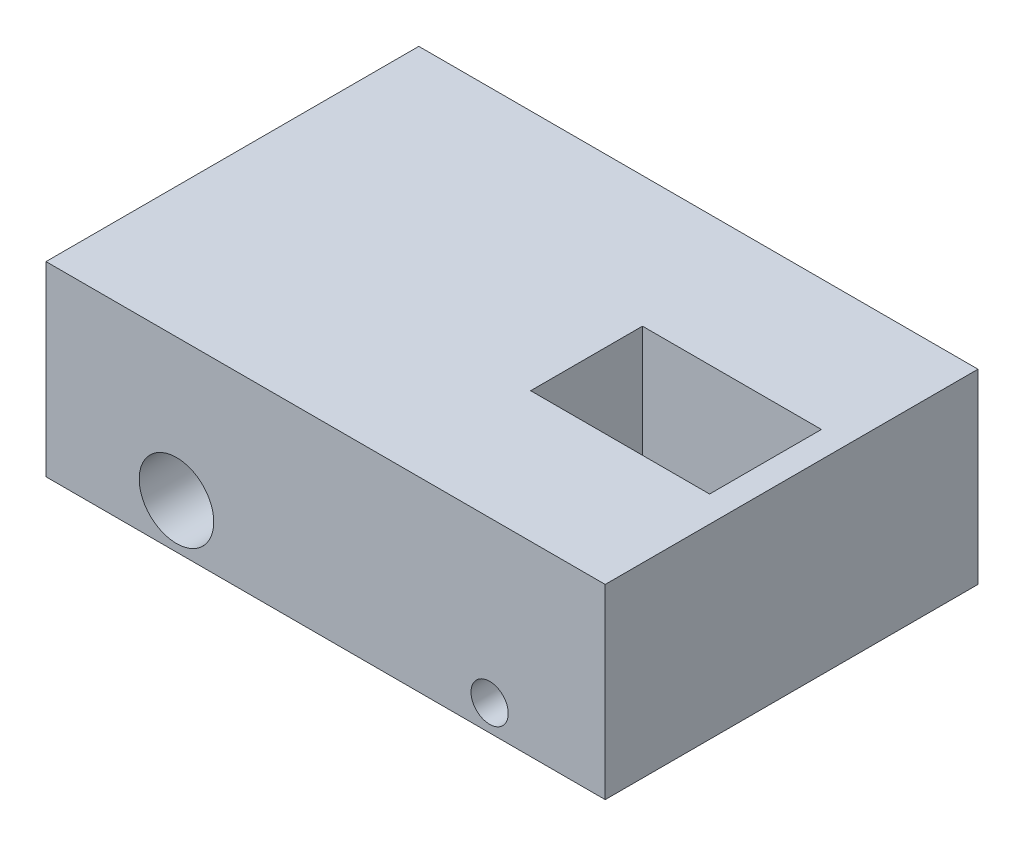
ISO-10303-21;
HEADER;
FILE_DESCRIPTION(('STEP AP214'),'2;1');
FILE_NAME('part.step','',(''),(''),'','','');
FILE_SCHEMA(('AUTOMOTIVE_DESIGN { 1 0 10303 214 1 1 1 1 }'));
ENDSEC;
DATA;
#1=APPLICATION_CONTEXT('core data for automotive mechanical design processes');
#2=APPLICATION_PROTOCOL_DEFINITION('international standard','automotive_design',2000,#1);
#3=PRODUCT_CONTEXT('',#1,'mechanical');
#4=PRODUCT('Part','Part','',(#3));
#5=PRODUCT_RELATED_PRODUCT_CATEGORY('part','',(#4));
#6=PRODUCT_DEFINITION_FORMATION('','',#4);
#7=PRODUCT_DEFINITION_CONTEXT('part definition',#1,'design');
#8=PRODUCT_DEFINITION('design','',#6,#7);
#9=PRODUCT_DEFINITION_SHAPE('','',#8);
#10=(LENGTH_UNIT() NAMED_UNIT(*) SI_UNIT(.MILLI.,.METRE.));
#11=(NAMED_UNIT(*) PLANE_ANGLE_UNIT() SI_UNIT($,.RADIAN.));
#12=(NAMED_UNIT(*) SI_UNIT($,.STERADIAN.) SOLID_ANGLE_UNIT());
#13=UNCERTAINTY_MEASURE_WITH_UNIT(LENGTH_MEASURE(1.E-05),#10,'distance_accuracy_value','');
#14=(GEOMETRIC_REPRESENTATION_CONTEXT(3) GLOBAL_UNCERTAINTY_ASSIGNED_CONTEXT((#13)) GLOBAL_UNIT_ASSIGNED_CONTEXT((#10,
#11,#12)) REPRESENTATION_CONTEXT('',''));
#15=CARTESIAN_POINT('',(0.,0.,0.));
#16=DIRECTION('',(0.,0.,1.));
#17=DIRECTION('',(1.,0.,0.));
#18=AXIS2_PLACEMENT_3D('',#15,#16,#17);
#19=CARTESIAN_POINT('',(-75.,50.,-50.));
#20=DIRECTION('',(1.,0.,0.));
#21=DIRECTION('',(0.,0.,-1.));
#22=AXIS2_PLACEMENT_3D('',#19,#20,#21);
#23=PLANE('',#22);
#24=DIRECTION('',(0.,0.,1.));
#25=VECTOR('',#24,1.);
#26=CARTESIAN_POINT('',(-75.,0.,-50.));
#27=LINE('',#26,#25);
#28=CARTESIAN_POINT('',(-75.,0.,-50.));
#29=VERTEX_POINT('',#28);
#30=CARTESIAN_POINT('',(-75.,0.,50.));
#31=VERTEX_POINT('',#30);
#32=EDGE_CURVE('E137',#29,#31,#27,.T.);
#33=ORIENTED_EDGE('',*,*,#32,.T.);
#34=DIRECTION('',(0.,-1.,0.));
#35=VECTOR('',#34,1.);
#36=CARTESIAN_POINT('',(-75.,50.,50.));
#37=LINE('',#36,#35);
#38=CARTESIAN_POINT('',(-75.,50.,50.));
#39=VERTEX_POINT('',#38);
#40=EDGE_CURVE('E11',#39,#31,#37,.T.);
#41=ORIENTED_EDGE('',*,*,#40,.F.);
#42=DIRECTION('',(0.,0.,1.));
#43=VECTOR('',#42,1.);
#44=CARTESIAN_POINT('',(-75.,50.,-50.));
#45=LINE('',#44,#43);
#46=CARTESIAN_POINT('',(-75.,50.,-50.));
#47=VERTEX_POINT('',#46);
#48=EDGE_CURVE('E140',#47,#39,#45,.T.);
#49=ORIENTED_EDGE('',*,*,#48,.F.);
#50=DIRECTION('',(0.,-1.,0.));
#51=VECTOR('',#50,1.);
#52=CARTESIAN_POINT('',(-75.,50.,-50.));
#53=LINE('',#52,#51);
#54=EDGE_CURVE('E150',#47,#29,#53,.T.);
#55=ORIENTED_EDGE('',*,*,#54,.T.);
#56=EDGE_LOOP('',(#33,#41,#49,#55));
#57=FACE_BOUND('',#56,.T.);
#58=ADVANCED_FACE('F33',(#57),#23,.F.);
#59=CARTESIAN_POINT('',(-75.,50.,50.));
#60=DIRECTION('',(0.,0.,-1.));
#61=DIRECTION('',(-1.,0.,0.));
#62=AXIS2_PLACEMENT_3D('',#59,#60,#61);
#63=PLANE('',#62);
#64=CARTESIAN_POINT('',(44.,7.00000000000001,50.));
#65=DIRECTION('',(0.,0.,-1.));
#66=DIRECTION('',(-1.,0.,0.));
#67=AXIS2_PLACEMENT_3D('',#64,#65,#66);
#68=CIRCLE('',#67,5.);
#69=CARTESIAN_POINT('',(39.,7.00000000000001,50.));
#70=VERTEX_POINT('',#69);
#71=EDGE_CURVE('E227',#70,#70,#68,.T.);
#72=ORIENTED_EDGE('',*,*,#71,.T.);
#73=EDGE_LOOP('',(#72));
#74=FACE_BOUND('',#73,.T.);
#75=CARTESIAN_POINT('',(-40.,12.,50.));
#76=DIRECTION('',(0.,0.,1.));
#77=DIRECTION('',(1.,0.,0.));
#78=AXIS2_PLACEMENT_3D('',#75,#76,#77);
#79=CIRCLE('',#78,10.);
#80=CARTESIAN_POINT('',(-30.,12.,50.));
#81=VERTEX_POINT('',#80);
#82=EDGE_CURVE('E133',#81,#81,#79,.T.);
#83=ORIENTED_EDGE('',*,*,#82,.F.);
#84=EDGE_LOOP('',(#83));
#85=FACE_BOUND('',#84,.T.);
#86=DIRECTION('',(1.,0.,0.));
#87=VECTOR('',#86,1.);
#88=CARTESIAN_POINT('',(-75.,0.,50.));
#89=LINE('',#88,#87);
#90=CARTESIAN_POINT('',(75.,0.,50.));
#91=VERTEX_POINT('',#90);
#92=EDGE_CURVE('E153',#31,#91,#89,.T.);
#93=ORIENTED_EDGE('',*,*,#92,.T.);
#94=DIRECTION('',(0.,-1.,0.));
#95=VECTOR('',#94,1.);
#96=CARTESIAN_POINT('',(75.,50.,50.));
#97=LINE('',#96,#95);
#98=CARTESIAN_POINT('',(75.,50.,50.));
#99=VERTEX_POINT('',#98);
#100=EDGE_CURVE('E41',#99,#91,#97,.T.);
#101=ORIENTED_EDGE('',*,*,#100,.F.);
#102=DIRECTION('',(1.,0.,0.));
#103=VECTOR('',#102,1.);
#104=CARTESIAN_POINT('',(-75.,50.,50.));
#105=LINE('',#104,#103);
#106=EDGE_CURVE('E143',#39,#99,#105,.T.);
#107=ORIENTED_EDGE('',*,*,#106,.F.);
#108=ORIENTED_EDGE('',*,*,#40,.T.);
#109=EDGE_LOOP('',(#93,#101,#107,#108));
#110=FACE_BOUND('',#109,.T.);
#111=ADVANCED_FACE('F182',(#74,#85,#110),#63,.F.);
#112=CARTESIAN_POINT('',(75.,50.,-50.));
#113=DIRECTION('',(-1.,0.,0.));
#114=DIRECTION('',(0.,0.,1.));
#115=AXIS2_PLACEMENT_3D('',#112,#113,#114);
#116=PLANE('',#115);
#117=DIRECTION('',(0.,0.,-1.));
#118=VECTOR('',#117,1.);
#119=CARTESIAN_POINT('',(75.,0.,-50.));
#120=LINE('',#119,#118);
#121=CARTESIAN_POINT('',(75.,0.,-50.));
#122=VERTEX_POINT('',#121);
#123=EDGE_CURVE('E155',#91,#122,#120,.T.);
#124=ORIENTED_EDGE('',*,*,#123,.T.);
#125=DIRECTION('',(0.,-1.,0.));
#126=VECTOR('',#125,1.);
#127=CARTESIAN_POINT('',(75.,50.,-50.));
#128=LINE('',#127,#126);
#129=CARTESIAN_POINT('',(75.,50.,-50.));
#130=VERTEX_POINT('',#129);
#131=EDGE_CURVE('E160',#130,#122,#128,.T.);
#132=ORIENTED_EDGE('',*,*,#131,.F.);
#133=DIRECTION('',(0.,0.,-1.));
#134=VECTOR('',#133,1.);
#135=CARTESIAN_POINT('',(75.,50.,-50.));
#136=LINE('',#135,#134);
#137=EDGE_CURVE('E146',#99,#130,#136,.T.);
#138=ORIENTED_EDGE('',*,*,#137,.F.);
#139=ORIENTED_EDGE('',*,*,#100,.T.);
#140=EDGE_LOOP('',(#124,#132,#138,#139));
#141=FACE_BOUND('',#140,.T.);
#142=ADVANCED_FACE('F168',(#141),#116,.F.);
#143=CARTESIAN_POINT('',(-75.,50.,-50.));
#144=DIRECTION('',(0.,0.,1.));
#145=DIRECTION('',(1.,0.,0.));
#146=AXIS2_PLACEMENT_3D('',#143,#144,#145);
#147=PLANE('',#146);
#148=CARTESIAN_POINT('',(44.,7.00000000000001,-50.));
#149=DIRECTION('',(0.,0.,-1.));
#150=DIRECTION('',(-1.,0.,0.));
#151=AXIS2_PLACEMENT_3D('',#148,#149,#150);
#152=CIRCLE('',#151,5.);
#153=CARTESIAN_POINT('',(39.,7.00000000000001,-50.));
#154=VERTEX_POINT('',#153);
#155=EDGE_CURVE('E235',#154,#154,#152,.T.);
#156=ORIENTED_EDGE('',*,*,#155,.F.);
#157=EDGE_LOOP('',(#156));
#158=FACE_BOUND('',#157,.T.);
#159=CARTESIAN_POINT('',(-40.,12.,-50.));
#160=DIRECTION('',(0.,0.,1.));
#161=DIRECTION('',(1.,0.,0.));
#162=AXIS2_PLACEMENT_3D('',#159,#160,#161);
#163=CIRCLE('',#162,10.);
#164=CARTESIAN_POINT('',(-30.,12.,-50.));
#165=VERTEX_POINT('',#164);
#166=EDGE_CURVE('E134',#165,#165,#163,.T.);
#167=ORIENTED_EDGE('',*,*,#166,.T.);
#168=EDGE_LOOP('',(#167));
#169=FACE_BOUND('',#168,.T.);
#170=DIRECTION('',(-1.,0.,0.));
#171=VECTOR('',#170,1.);
#172=CARTESIAN_POINT('',(-75.,0.,-50.));
#173=LINE('',#172,#171);
#174=EDGE_CURVE('E144',#122,#29,#173,.T.);
#175=ORIENTED_EDGE('',*,*,#174,.T.);
#176=ORIENTED_EDGE('',*,*,#54,.F.);
#177=DIRECTION('',(-1.,0.,0.));
#178=VECTOR('',#177,1.);
#179=CARTESIAN_POINT('',(-75.,50.,-50.));
#180=LINE('',#179,#178);
#181=EDGE_CURVE('E148',#130,#47,#180,.T.);
#182=ORIENTED_EDGE('',*,*,#181,.F.);
#183=ORIENTED_EDGE('',*,*,#131,.T.);
#184=EDGE_LOOP('',(#175,#176,#182,#183));
#185=FACE_BOUND('',#184,.T.);
#186=ADVANCED_FACE('F175',(#158,#169,#185),#147,.F.);
#187=CARTESIAN_POINT('',(0.,50.,0.));
#188=DIRECTION('',(0.,1.,0.));
#189=DIRECTION('',(0.,0.,1.));
#190=AXIS2_PLACEMENT_3D('',#187,#188,#189);
#191=PLANE('',#190);
#192=DIRECTION('',(0.,0.,1.));
#193=VECTOR('',#192,1.);
#194=CARTESIAN_POINT('',(20.,50.,0.));
#195=LINE('',#194,#193);
#196=CARTESIAN_POINT('',(20.,50.,-15.));
#197=VERTEX_POINT('',#196);
#198=CARTESIAN_POINT('',(20.,50.,15.));
#199=VERTEX_POINT('',#198);
#200=EDGE_CURVE('E131',#197,#199,#195,.T.);
#201=ORIENTED_EDGE('',*,*,#200,.F.);
#202=DIRECTION('',(-1.,0.,0.));
#203=VECTOR('',#202,1.);
#204=CARTESIAN_POINT('',(0.,50.,-15.));
#205=LINE('',#204,#203);
#206=CARTESIAN_POINT('',(68.,50.,-15.));
#207=VERTEX_POINT('',#206);
#208=EDGE_CURVE('E124',#207,#197,#205,.T.);
#209=ORIENTED_EDGE('',*,*,#208,.F.);
#210=DIRECTION('',(0.,0.,-1.));
#211=VECTOR('',#210,1.);
#212=CARTESIAN_POINT('',(68.,50.,0.));
#213=LINE('',#212,#211);
#214=CARTESIAN_POINT('',(68.,50.,15.));
#215=VERTEX_POINT('',#214);
#216=EDGE_CURVE('E104',#215,#207,#213,.T.);
#217=ORIENTED_EDGE('',*,*,#216,.F.);
#218=DIRECTION('',(1.,0.,0.));
#219=VECTOR('',#218,1.);
#220=CARTESIAN_POINT('',(0.,50.,15.));
#221=LINE('',#220,#219);
#222=EDGE_CURVE('E129',#199,#215,#221,.T.);
#223=ORIENTED_EDGE('',*,*,#222,.F.);
#224=EDGE_LOOP('',(#201,#209,#217,#223));
#225=FACE_BOUND('',#224,.T.);
#226=ORIENTED_EDGE('',*,*,#48,.T.);
#227=ORIENTED_EDGE('',*,*,#106,.T.);
#228=ORIENTED_EDGE('',*,*,#137,.T.);
#229=ORIENTED_EDGE('',*,*,#181,.T.);
#230=EDGE_LOOP('',(#226,#227,#228,#229));
#231=FACE_BOUND('',#230,.T.);
#232=ADVANCED_FACE('F181',(#225,#231),#191,.T.);
#233=CARTESIAN_POINT('',(0.,0.,0.));
#234=DIRECTION('',(0.,1.,0.));
#235=DIRECTION('',(0.,0.,1.));
#236=AXIS2_PLACEMENT_3D('',#233,#234,#235);
#237=PLANE('',#236);
#238=DIRECTION('',(1.,0.,0.));
#239=VECTOR('',#238,1.);
#240=CARTESIAN_POINT('',(20.,0.,-15.));
#241=LINE('',#240,#239);
#242=CARTESIAN_POINT('',(20.,0.,-15.));
#243=VERTEX_POINT('',#242);
#244=CARTESIAN_POINT('',(68.,0.,-15.));
#245=VERTEX_POINT('',#244);
#246=EDGE_CURVE('E110',#243,#245,#241,.T.);
#247=ORIENTED_EDGE('',*,*,#246,.F.);
#248=DIRECTION('',(0.,0.,-1.));
#249=VECTOR('',#248,1.);
#250=CARTESIAN_POINT('',(20.,0.,15.));
#251=LINE('',#250,#249);
#252=CARTESIAN_POINT('',(20.,0.,15.));
#253=VERTEX_POINT('',#252);
#254=EDGE_CURVE('E56',#253,#243,#251,.T.);
#255=ORIENTED_EDGE('',*,*,#254,.F.);
#256=DIRECTION('',(-1.,0.,0.));
#257=VECTOR('',#256,1.);
#258=CARTESIAN_POINT('',(20.,0.,15.));
#259=LINE('',#258,#257);
#260=CARTESIAN_POINT('',(68.,0.,15.));
#261=VERTEX_POINT('',#260);
#262=EDGE_CURVE('E117',#261,#253,#259,.T.);
#263=ORIENTED_EDGE('',*,*,#262,.F.);
#264=DIRECTION('',(0.,0.,1.));
#265=VECTOR('',#264,1.);
#266=CARTESIAN_POINT('',(68.,0.,15.));
#267=LINE('',#266,#265);
#268=EDGE_CURVE('E101',#245,#261,#267,.T.);
#269=ORIENTED_EDGE('',*,*,#268,.F.);
#270=EDGE_LOOP('',(#247,#255,#263,#269));
#271=FACE_BOUND('',#270,.T.);
#272=ORIENTED_EDGE('',*,*,#32,.F.);
#273=ORIENTED_EDGE('',*,*,#174,.F.);
#274=ORIENTED_EDGE('',*,*,#123,.F.);
#275=ORIENTED_EDGE('',*,*,#92,.F.);
#276=EDGE_LOOP('',(#272,#273,#274,#275));
#277=FACE_BOUND('',#276,.T.);
#278=ADVANCED_FACE('F114',(#271,#277),#237,.F.);
#279=CARTESIAN_POINT('',(-40.,12.,-50.));
#280=DIRECTION('',(0.,0.,1.));
#281=DIRECTION('',(1.,0.,0.));
#282=AXIS2_PLACEMENT_3D('',#279,#280,#281);
#283=CYLINDRICAL_SURFACE('',#282,10.);
#284=CARTESIAN_POINT('',(-30.,12.,-50.));
#285=CARTESIAN_POINT('',(-30.,12.,-48.9583333333333));
#286=CARTESIAN_POINT('',(-30.,12.,-47.9166666666667));
#287=CARTESIAN_POINT('',(-30.,12.,-45.8333333333333));
#288=CARTESIAN_POINT('',(-30.,12.,-44.7916666666667));
#289=CARTESIAN_POINT('',(-30.,12.,-42.7083333333333));
#290=CARTESIAN_POINT('',(-30.,12.,-41.6666666666667));
#291=CARTESIAN_POINT('',(-30.,12.,-39.5833333333333));
#292=CARTESIAN_POINT('',(-30.,12.,-38.5416666666667));
#293=CARTESIAN_POINT('',(-30.,12.,-36.4583333333333));
#294=CARTESIAN_POINT('',(-30.,12.,-35.4166666666667));
#295=CARTESIAN_POINT('',(-30.,12.,-33.3333333333333));
#296=CARTESIAN_POINT('',(-30.,12.,-32.2916666666667));
#297=CARTESIAN_POINT('',(-30.,12.,-30.2083333333333));
#298=CARTESIAN_POINT('',(-30.,12.,-29.1666666666667));
#299=CARTESIAN_POINT('',(-30.,12.,-27.0833333333333));
#300=CARTESIAN_POINT('',(-30.,12.,-26.0416666666667));
#301=CARTESIAN_POINT('',(-30.,12.,-23.9583333333333));
#302=CARTESIAN_POINT('',(-30.,12.,-22.9166666666667));
#303=CARTESIAN_POINT('',(-30.,12.,-20.8333333333333));
#304=CARTESIAN_POINT('',(-30.,12.,-19.7916666666667));
#305=CARTESIAN_POINT('',(-30.,12.,-17.7083333333333));
#306=CARTESIAN_POINT('',(-30.,12.,-16.6666666666667));
#307=CARTESIAN_POINT('',(-30.,12.,-14.5833333333333));
#308=CARTESIAN_POINT('',(-30.,12.,-13.5416666666667));
#309=CARTESIAN_POINT('',(-30.,12.,-11.4583333333333));
#310=CARTESIAN_POINT('',(-30.,12.,-10.4166666666667));
#311=CARTESIAN_POINT('',(-30.,12.,-8.33333333333333));
#312=CARTESIAN_POINT('',(-30.,12.,-7.29166666666667));
#313=CARTESIAN_POINT('',(-30.,12.,-5.20833333333333));
#314=CARTESIAN_POINT('',(-30.,12.,-4.16666666666667));
#315=CARTESIAN_POINT('',(-30.,12.,-2.08333333333334));
#316=CARTESIAN_POINT('',(-30.,12.,-1.04166666666667));
#317=CARTESIAN_POINT('',(-30.,12.,1.04166666666667));
#318=CARTESIAN_POINT('',(-30.,12.,2.08333333333334));
#319=CARTESIAN_POINT('',(-30.,12.,4.16666666666667));
#320=CARTESIAN_POINT('',(-30.,12.,5.20833333333333));
#321=CARTESIAN_POINT('',(-30.,12.,7.29166666666667));
#322=CARTESIAN_POINT('',(-30.,12.,8.33333333333334));
#323=CARTESIAN_POINT('',(-30.,12.,10.4166666666667));
#324=CARTESIAN_POINT('',(-30.,12.,11.4583333333333));
#325=CARTESIAN_POINT('',(-30.,12.,13.5416666666667));
#326=CARTESIAN_POINT('',(-30.,12.,14.5833333333333));
#327=CARTESIAN_POINT('',(-30.,12.,16.6666666666667));
#328=CARTESIAN_POINT('',(-30.,12.,17.7083333333333));
#329=CARTESIAN_POINT('',(-30.,12.,19.7916666666667));
#330=CARTESIAN_POINT('',(-30.,12.,20.8333333333333));
#331=CARTESIAN_POINT('',(-30.,12.,22.9166666666667));
#332=CARTESIAN_POINT('',(-30.,12.,23.9583333333333));
#333=CARTESIAN_POINT('',(-30.,12.,26.0416666666667));
#334=CARTESIAN_POINT('',(-30.,12.,27.0833333333333));
#335=CARTESIAN_POINT('',(-30.,12.,29.1666666666667));
#336=CARTESIAN_POINT('',(-30.,12.,30.2083333333333));
#337=CARTESIAN_POINT('',(-30.,12.,32.2916666666667));
#338=CARTESIAN_POINT('',(-30.,12.,33.3333333333333));
#339=CARTESIAN_POINT('',(-30.,12.,35.4166666666667));
#340=CARTESIAN_POINT('',(-30.,12.,36.4583333333333));
#341=CARTESIAN_POINT('',(-30.,12.,38.5416666666667));
#342=CARTESIAN_POINT('',(-30.,12.,39.5833333333333));
#343=CARTESIAN_POINT('',(-30.,12.,41.6666666666667));
#344=CARTESIAN_POINT('',(-30.,12.,42.7083333333333));
#345=CARTESIAN_POINT('',(-30.,12.,44.7916666666667));
#346=CARTESIAN_POINT('',(-30.,12.,45.8333333333333));
#347=CARTESIAN_POINT('',(-30.,12.,47.9166666666667));
#348=CARTESIAN_POINT('',(-30.,12.,48.9583333333333));
#349=CARTESIAN_POINT('',(-30.,12.,50.));
#350=B_SPLINE_CURVE_WITH_KNOTS('',3,(#284,#285,#286,#287,#288,#289,#290,#291,#292,#293,#294,
#295,#296,#297,#298,#299,#300,#301,#302,#303,#304,#305,#306,#307,#308,#309,#310,#311,#312,#313,
#314,#315,#316,#317,#318,#319,#320,#321,#322,#323,#324,#325,#326,#327,#328,#329,#330,#331,#332,
#333,#334,#335,#336,#337,#338,#339,#340,#341,#342,#343,#344,#345,#346,#347,#348,#349),
.UNSPECIFIED.,.F.,.F.,(4,2,2,2,2,2,2,2,2,2,2,2,2,2,2,2,2,2,2,2,2,2,2,2,2,2,2,2,2,2,2,2,4),(0.,
3.125,6.25000000000001,9.375,12.5,15.625,18.75,21.875,25.,28.125,31.25,34.375,37.5,40.625,43.75,
46.875,50.,53.125,56.25,59.375,62.5,65.625,68.75,71.875,75.,78.125,81.25,84.375,87.5,90.625,
93.75,96.875,100.),.UNSPECIFIED.);
#351=EDGE_CURVE('BSEAM198',#165,#81,#350,.T.);
#352=ORIENTED_EDGE('',*,*,#166,.F.);
#353=ORIENTED_EDGE('',*,*,#82,.T.);
#354=ORIENTED_EDGE('',*,*,#351,.T.);
#355=ORIENTED_EDGE('',*,*,#351,.F.);
#356=EDGE_LOOP('',(#352,#354,#353,#355));
#357=FACE_BOUND('',#356,.T.);
#358=ADVANCED_FACE('F198',(#357),#283,.F.);
#359=CARTESIAN_POINT('',(20.,100.,15.));
#360=DIRECTION('',(-1.,0.,0.));
#361=DIRECTION('',(0.,0.,1.));
#362=AXIS2_PLACEMENT_3D('',#359,#360,#361);
#363=PLANE('',#362);
#364=ORIENTED_EDGE('',*,*,#200,.T.);
#365=DIRECTION('',(0.,-1.,0.));
#366=VECTOR('',#365,1.);
#367=CARTESIAN_POINT('',(20.,100.,15.));
#368=LINE('',#367,#366);
#369=EDGE_CURVE('E122',#199,#253,#368,.T.);
#370=ORIENTED_EDGE('',*,*,#369,.T.);
#371=ORIENTED_EDGE('',*,*,#254,.T.);
#372=DIRECTION('',(0.,-1.,0.));
#373=VECTOR('',#372,1.);
#374=CARTESIAN_POINT('',(20.,100.,-15.));
#375=LINE('',#374,#373);
#376=EDGE_CURVE('E107',#197,#243,#375,.T.);
#377=ORIENTED_EDGE('',*,*,#376,.F.);
#378=EDGE_LOOP('',(#364,#370,#371,#377));
#379=FACE_BOUND('',#378,.T.);
#380=ADVANCED_FACE('F204',(#379),#363,.F.);
#381=CARTESIAN_POINT('',(20.,100.,15.));
#382=DIRECTION('',(0.,0.,1.));
#383=DIRECTION('',(1.,0.,0.));
#384=AXIS2_PLACEMENT_3D('',#381,#382,#383);
#385=PLANE('',#384);
#386=CARTESIAN_POINT('',(44.,7.00000000000001,15.));
#387=DIRECTION('',(0.,0.,1.));
#388=DIRECTION('',(1.,0.,0.));
#389=AXIS2_PLACEMENT_3D('',#386,#387,#388);
#390=CIRCLE('',#389,5.);
#391=CARTESIAN_POINT('',(49.,7.00000000000001,15.));
#392=VERTEX_POINT('',#391);
#393=EDGE_CURVE('E230',#392,#392,#390,.T.);
#394=ORIENTED_EDGE('',*,*,#393,.T.);
#395=EDGE_LOOP('',(#394));
#396=FACE_BOUND('',#395,.T.);
#397=ORIENTED_EDGE('',*,*,#222,.T.);
#398=DIRECTION('',(0.,-1.,0.));
#399=VECTOR('',#398,1.);
#400=CARTESIAN_POINT('',(68.,100.,15.));
#401=LINE('',#400,#399);
#402=EDGE_CURVE('E106',#215,#261,#401,.T.);
#403=ORIENTED_EDGE('',*,*,#402,.T.);
#404=ORIENTED_EDGE('',*,*,#262,.T.);
#405=ORIENTED_EDGE('',*,*,#369,.F.);
#406=EDGE_LOOP('',(#397,#403,#404,#405));
#407=FACE_BOUND('',#406,.T.);
#408=ADVANCED_FACE('F208',(#396,#407),#385,.F.);
#409=CARTESIAN_POINT('',(68.,100.,15.));
#410=DIRECTION('',(1.,0.,0.));
#411=DIRECTION('',(0.,0.,-1.));
#412=AXIS2_PLACEMENT_3D('',#409,#410,#411);
#413=PLANE('',#412);
#414=ORIENTED_EDGE('',*,*,#216,.T.);
#415=DIRECTION('',(0.,-1.,0.));
#416=VECTOR('',#415,1.);
#417=CARTESIAN_POINT('',(68.,100.,-15.));
#418=LINE('',#417,#416);
#419=EDGE_CURVE('E48',#207,#245,#418,.T.);
#420=ORIENTED_EDGE('',*,*,#419,.T.);
#421=ORIENTED_EDGE('',*,*,#268,.T.);
#422=ORIENTED_EDGE('',*,*,#402,.F.);
#423=EDGE_LOOP('',(#414,#420,#421,#422));
#424=FACE_BOUND('',#423,.T.);
#425=ADVANCED_FACE('F98',(#424),#413,.F.);
#426=CARTESIAN_POINT('',(20.,100.,-15.));
#427=DIRECTION('',(0.,0.,-1.));
#428=DIRECTION('',(-1.,0.,0.));
#429=AXIS2_PLACEMENT_3D('',#426,#427,#428);
#430=PLANE('',#429);
#431=CARTESIAN_POINT('',(44.,7.00000000000001,-15.));
#432=DIRECTION('',(0.,0.,-1.));
#433=DIRECTION('',(-1.,0.,0.));
#434=AXIS2_PLACEMENT_3D('',#431,#432,#433);
#435=CIRCLE('',#434,5.);
#436=CARTESIAN_POINT('',(39.,7.00000000000001,-15.));
#437=VERTEX_POINT('',#436);
#438=EDGE_CURVE('E36',#437,#437,#435,.T.);
#439=ORIENTED_EDGE('',*,*,#438,.T.);
#440=EDGE_LOOP('',(#439));
#441=FACE_BOUND('',#440,.T.);
#442=ORIENTED_EDGE('',*,*,#208,.T.);
#443=ORIENTED_EDGE('',*,*,#376,.T.);
#444=ORIENTED_EDGE('',*,*,#246,.T.);
#445=ORIENTED_EDGE('',*,*,#419,.F.);
#446=EDGE_LOOP('',(#442,#443,#444,#445));
#447=FACE_BOUND('',#446,.T.);
#448=ADVANCED_FACE('F111',(#441,#447),#430,.F.);
#449=CARTESIAN_POINT('',(44.,7.00000000000001,50.));
#450=DIRECTION('',(0.,0.,-1.));
#451=DIRECTION('',(-1.,0.,0.));
#452=AXIS2_PLACEMENT_3D('',#449,#450,#451);
#453=CYLINDRICAL_SURFACE('',#452,5.);
#454=ORIENTED_EDGE('',*,*,#155,.T.);
#455=EDGE_LOOP('',(#454));
#456=FACE_BOUND('',#455,.T.);
#457=ORIENTED_EDGE('',*,*,#438,.F.);
#458=EDGE_LOOP('',(#457));
#459=FACE_BOUND('',#458,.T.);
#460=ADVANCED_FACE('F211',(#456,#459),#453,.F.);
#461=ORIENTED_EDGE('',*,*,#71,.F.);
#462=EDGE_LOOP('',(#461));
#463=FACE_BOUND('',#462,.T.);
#464=ORIENTED_EDGE('',*,*,#393,.F.);
#465=EDGE_LOOP('',(#464));
#466=FACE_BOUND('',#465,.T.);
#467=ADVANCED_FACE('F218',(#463,#466),#453,.F.);
#468=CLOSED_SHELL('',(#58,#111,#142,#186,#232,#278,#358,#380,#408,#425,#448,#460,#467));
#469=MANIFOLD_SOLID_BREP('B2',#468);
#470=ADVANCED_BREP_SHAPE_REPRESENTATION('',(#18,#469),#14);
#471=SHAPE_DEFINITION_REPRESENTATION(#9,#470);
ENDSEC;
END-ISO-10303-21;
